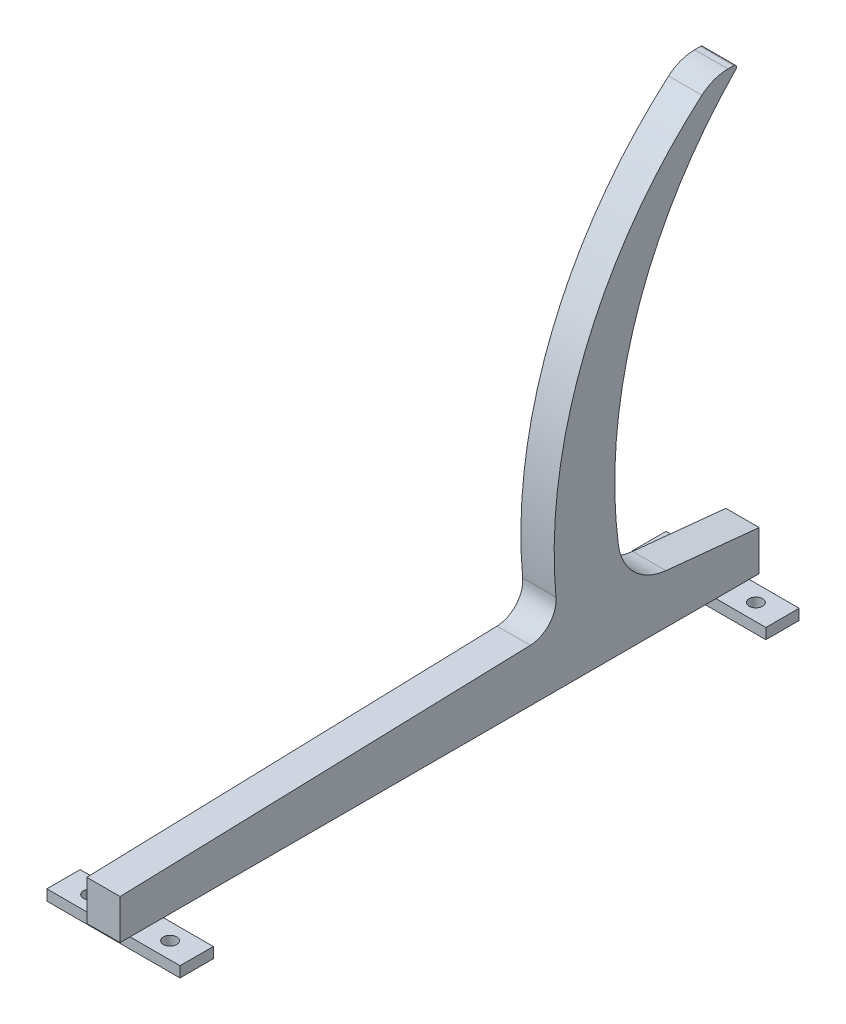
ISO-10303-21;
HEADER;
FILE_DESCRIPTION(('STEP AP214'),'2;1');
FILE_NAME('part.step','',(''),(''),'','','');
FILE_SCHEMA(('AUTOMOTIVE_DESIGN { 1 0 10303 214 1 1 1 1 }'));
ENDSEC;
DATA;
#1=APPLICATION_CONTEXT('core data for automotive mechanical design processes');
#2=APPLICATION_PROTOCOL_DEFINITION('international standard','automotive_design',2000,#1);
#3=PRODUCT_CONTEXT('',#1,'mechanical');
#4=PRODUCT('Part','Part','',(#3));
#5=PRODUCT_RELATED_PRODUCT_CATEGORY('part','',(#4));
#6=PRODUCT_DEFINITION_FORMATION('','',#4);
#7=PRODUCT_DEFINITION_CONTEXT('part definition',#1,'design');
#8=PRODUCT_DEFINITION('design','',#6,#7);
#9=PRODUCT_DEFINITION_SHAPE('','',#8);
#10=(LENGTH_UNIT() NAMED_UNIT(*) SI_UNIT(.MILLI.,.METRE.));
#11=(NAMED_UNIT(*) PLANE_ANGLE_UNIT() SI_UNIT($,.RADIAN.));
#12=(NAMED_UNIT(*) SI_UNIT($,.STERADIAN.) SOLID_ANGLE_UNIT());
#13=UNCERTAINTY_MEASURE_WITH_UNIT(LENGTH_MEASURE(1.E-05),#10,'distance_accuracy_value','');
#14=(GEOMETRIC_REPRESENTATION_CONTEXT(3) GLOBAL_UNCERTAINTY_ASSIGNED_CONTEXT((#13)) GLOBAL_UNIT_ASSIGNED_CONTEXT((#10,
#11,#12)) REPRESENTATION_CONTEXT('',''));
#15=CARTESIAN_POINT('',(0.,0.,0.));
#16=DIRECTION('',(0.,0.,1.));
#17=DIRECTION('',(1.,0.,0.));
#18=AXIS2_PLACEMENT_3D('',#15,#16,#17);
#19=CARTESIAN_POINT('',(15.875,0.,304.8));
#20=DIRECTION('',(0.,1.,0.));
#21=DIRECTION('',(0.,0.,1.));
#22=AXIS2_PLACEMENT_3D('',#19,#20,#21);
#23=PLANE('',#22);
#24=DIRECTION('',(1.,0.,0.));
#25=VECTOR('',#24,1.);
#26=CARTESIAN_POINT('',(-63.5,0.,263.525));
#27=LINE('',#26,#25);
#28=CARTESIAN_POINT('',(-15.875,0.,263.525));
#29=VERTEX_POINT('',#28);
#30=CARTESIAN_POINT('',(15.875,0.,263.525));
#31=VERTEX_POINT('',#30);
#32=EDGE_CURVE('E370',#29,#31,#27,.T.);
#33=ORIENTED_EDGE('',*,*,#32,.F.);
#34=DIRECTION('',(0.,0.,-1.));
#35=VECTOR('',#34,1.);
#36=CARTESIAN_POINT('',(-15.875,0.,304.8));
#37=LINE('',#36,#35);
#38=CARTESIAN_POINT('',(-15.875,1.04399608818813E-13,-263.525));
#39=VERTEX_POINT('',#38);
#40=EDGE_CURVE('E462',#29,#39,#37,.T.);
#41=ORIENTED_EDGE('',*,*,#40,.T.);
#42=DIRECTION('',(-1.,0.,0.));
#43=VECTOR('',#42,1.);
#44=CARTESIAN_POINT('',(-63.5,0.,-263.525));
#45=LINE('',#44,#43);
#46=CARTESIAN_POINT('',(15.875,1.04399608818813E-13,-263.525));
#47=VERTEX_POINT('',#46);
#48=EDGE_CURVE('E255',#47,#39,#45,.T.);
#49=ORIENTED_EDGE('',*,*,#48,.F.);
#50=DIRECTION('',(0.,0.,-1.));
#51=VECTOR('',#50,1.);
#52=CARTESIAN_POINT('',(15.875,0.,304.8));
#53=LINE('',#52,#51);
#54=EDGE_CURVE('E478',#31,#47,#53,.T.);
#55=ORIENTED_EDGE('',*,*,#54,.F.);
#56=EDGE_LOOP('',(#33,#41,#49,#55));
#57=FACE_BOUND('',#56,.T.);
#58=ADVANCED_FACE('F39',(#57),#23,.F.);
#59=DIRECTION('',(-1.,0.,0.));
#60=VECTOR('',#59,1.);
#61=CARTESIAN_POINT('',(-63.5,0.,295.275));
#62=LINE('',#61,#60);
#63=CARTESIAN_POINT('',(15.875,0.,295.275));
#64=VERTEX_POINT('',#63);
#65=CARTESIAN_POINT('',(-15.875,0.,295.275));
#66=VERTEX_POINT('',#65);
#67=EDGE_CURVE('E375',#64,#66,#62,.T.);
#68=ORIENTED_EDGE('',*,*,#67,.F.);
#69=CARTESIAN_POINT('',(15.875,0.,304.8));
#70=VERTEX_POINT('',#69);
#71=EDGE_CURVE('E290',#70,#64,#53,.T.);
#72=ORIENTED_EDGE('',*,*,#71,.F.);
#73=DIRECTION('',(-1.,0.,0.));
#74=VECTOR('',#73,1.);
#75=CARTESIAN_POINT('',(15.875,0.,304.8));
#76=LINE('',#75,#74);
#77=CARTESIAN_POINT('',(-15.875,0.,304.8));
#78=VERTEX_POINT('',#77);
#79=EDGE_CURVE('E341',#70,#78,#76,.T.);
#80=ORIENTED_EDGE('',*,*,#79,.T.);
#81=EDGE_CURVE('E309',#78,#66,#37,.T.);
#82=ORIENTED_EDGE('',*,*,#81,.T.);
#83=EDGE_LOOP('',(#68,#72,#80,#82));
#84=FACE_BOUND('',#83,.T.);
#85=ADVANCED_FACE('F424',(#84),#23,.F.);
#86=DIRECTION('',(1.,0.,0.));
#87=VECTOR('',#86,1.);
#88=CARTESIAN_POINT('',(-63.5,0.,-295.275));
#89=LINE('',#88,#87);
#90=CARTESIAN_POINT('',(-15.875,1.10231989199752E-13,-295.275));
#91=VERTEX_POINT('',#90);
#92=CARTESIAN_POINT('',(15.875,0.,-295.275));
#93=VERTEX_POINT('',#92);
#94=EDGE_CURVE('E261',#91,#93,#89,.T.);
#95=ORIENTED_EDGE('',*,*,#94,.F.);
#96=CARTESIAN_POINT('',(-15.875,1.11981703314034E-13,-304.8));
#97=VERTEX_POINT('',#96);
#98=EDGE_CURVE('E229',#91,#97,#37,.T.);
#99=ORIENTED_EDGE('',*,*,#98,.T.);
#100=DIRECTION('',(-1.,0.,0.));
#101=VECTOR('',#100,1.);
#102=CARTESIAN_POINT('',(15.875,1.11981703314034E-13,-304.8));
#103=LINE('',#102,#101);
#104=CARTESIAN_POINT('',(15.875,1.11981703314034E-13,-304.8));
#105=VERTEX_POINT('',#104);
#106=EDGE_CURVE('E337',#105,#97,#103,.T.);
#107=ORIENTED_EDGE('',*,*,#106,.F.);
#108=EDGE_CURVE('E289',#93,#105,#53,.T.);
#109=ORIENTED_EDGE('',*,*,#108,.F.);
#110=EDGE_LOOP('',(#95,#99,#107,#109));
#111=FACE_BOUND('',#110,.T.);
#112=ADVANCED_FACE('F430',(#111),#23,.F.);
#113=CARTESIAN_POINT('',(15.875,38.1,304.8));
#114=DIRECTION('',(0.,0.,-1.));
#115=DIRECTION('',(-1.,0.,0.));
#116=AXIS2_PLACEMENT_3D('',#113,#114,#115);
#117=PLANE('',#116);
#118=DIRECTION('',(0.,-1.,0.));
#119=VECTOR('',#118,1.);
#120=CARTESIAN_POINT('',(-15.875,38.1,304.8));
#121=LINE('',#120,#119);
#122=CARTESIAN_POINT('',(-15.875,38.1,304.8));
#123=VERTEX_POINT('',#122);
#124=EDGE_CURVE('E230',#123,#78,#121,.T.);
#125=ORIENTED_EDGE('',*,*,#124,.T.);
#126=ORIENTED_EDGE('',*,*,#79,.F.);
#127=DIRECTION('',(0.,-1.,0.));
#128=VECTOR('',#127,1.);
#129=CARTESIAN_POINT('',(15.875,38.1,304.8));
#130=LINE('',#129,#128);
#131=CARTESIAN_POINT('',(15.875,38.1,304.8));
#132=VERTEX_POINT('',#131);
#133=EDGE_CURVE('E284',#132,#70,#130,.T.);
#134=ORIENTED_EDGE('',*,*,#133,.F.);
#135=DIRECTION('',(-1.,0.,0.));
#136=VECTOR('',#135,1.);
#137=CARTESIAN_POINT('',(15.875,38.1,304.8));
#138=LINE('',#137,#136);
#139=EDGE_CURVE('E306',#132,#123,#138,.T.);
#140=ORIENTED_EDGE('',*,*,#139,.T.);
#141=EDGE_LOOP('',(#125,#126,#134,#140));
#142=FACE_BOUND('',#141,.T.);
#143=ADVANCED_FACE('F436',(#142),#117,.F.);
#144=CARTESIAN_POINT('',(15.875,38.1000000000001,-304.8));
#145=DIRECTION('',(0.,0.,1.));
#146=DIRECTION('',(1.,0.,0.));
#147=AXIS2_PLACEMENT_3D('',#144,#145,#146);
#148=PLANE('',#147);
#149=DIRECTION('',(0.,1.,0.));
#150=VECTOR('',#149,1.);
#151=CARTESIAN_POINT('',(-15.875,38.1000000000001,-304.8));
#152=LINE('',#151,#150);
#153=CARTESIAN_POINT('',(-15.875,38.1000000000001,-304.8));
#154=VERTEX_POINT('',#153);
#155=EDGE_CURVE('E315',#97,#154,#152,.T.);
#156=ORIENTED_EDGE('',*,*,#155,.T.);
#157=DIRECTION('',(-1.,0.,0.));
#158=VECTOR('',#157,1.);
#159=CARTESIAN_POINT('',(15.875,38.1000000000001,-304.8));
#160=LINE('',#159,#158);
#161=CARTESIAN_POINT('',(15.875,38.1000000000001,-304.8));
#162=VERTEX_POINT('',#161);
#163=EDGE_CURVE('E333',#162,#154,#160,.T.);
#164=ORIENTED_EDGE('',*,*,#163,.F.);
#165=DIRECTION('',(0.,1.,0.));
#166=VECTOR('',#165,1.);
#167=CARTESIAN_POINT('',(15.875,38.1000000000001,-304.8));
#168=LINE('',#167,#166);
#169=EDGE_CURVE('E291',#105,#162,#168,.T.);
#170=ORIENTED_EDGE('',*,*,#169,.F.);
#171=ORIENTED_EDGE('',*,*,#106,.T.);
#172=EDGE_LOOP('',(#156,#164,#170,#171));
#173=FACE_BOUND('',#172,.T.);
#174=ADVANCED_FACE('F445',(#173),#148,.F.);
#175=CARTESIAN_POINT('',(15.875,38.1000000000001,-304.8));
#176=DIRECTION('',(0.,-0.995037190209989,0.099503719020998));
#177=DIRECTION('',(0.,-0.099503719020998,-0.995037190209989));
#178=AXIS2_PLACEMENT_3D('',#175,#176,#177);
#179=PLANE('',#178);
#180=DIRECTION('',(0.,0.099503719020998,0.995037190209989));
#181=VECTOR('',#180,1.);
#182=CARTESIAN_POINT('',(-15.875,38.1000000000001,-304.8));
#183=LINE('',#182,#181);
#184=CARTESIAN_POINT('',(-15.875,47.0021545395077,-215.778454604923));
#185=VERTEX_POINT('',#184);
#186=EDGE_CURVE('E312',#154,#185,#183,.T.);
#187=ORIENTED_EDGE('',*,*,#186,.T.);
#188=DIRECTION('',(1.,0.,0.));
#189=VECTOR('',#188,1.);
#190=CARTESIAN_POINT('',(15.875,47.0021545395077,-215.778454604923));
#191=LINE('',#190,#189);
#192=CARTESIAN_POINT('',(15.875,47.0021545395077,-215.778454604923));
#193=VERTEX_POINT('',#192);
#194=EDGE_CURVE('E359',#185,#193,#191,.T.);
#195=ORIENTED_EDGE('',*,*,#194,.T.);
#196=DIRECTION('',(0.,0.099503719020998,0.995037190209989));
#197=VECTOR('',#196,1.);
#198=CARTESIAN_POINT('',(15.875,38.1000000000001,-304.8));
#199=LINE('',#198,#197);
#200=EDGE_CURVE('E296',#162,#193,#199,.T.);
#201=ORIENTED_EDGE('',*,*,#200,.F.);
#202=ORIENTED_EDGE('',*,*,#163,.T.);
#203=EDGE_LOOP('',(#187,#195,#201,#202));
#204=FACE_BOUND('',#203,.T.);
#205=ADVANCED_FACE('F491',(#204),#179,.F.);
#206=CARTESIAN_POINT('',(15.875,143.830650902039,-573.408718297187));
#207=DIRECTION('',(-1.,0.,0.));
#208=DIRECTION('',(0.,0.,1.));
#209=AXIS2_PLACEMENT_3D('',#206,#207,#208);
#210=CYLINDRICAL_SURFACE('',#209,406.4);
#211=CARTESIAN_POINT('',(-15.875,143.830650902039,-573.408718297187));
#212=DIRECTION('',(-1.,0.,0.));
#213=DIRECTION('',(0.,0.,1.));
#214=AXIS2_PLACEMENT_3D('',#211,#212,#213);
#215=CIRCLE('',#214,406.4);
#216=CARTESIAN_POINT('',(-15.875,90.9385285021946,-170.465318564619));
#217=VERTEX_POINT('',#216);
#218=CARTESIAN_POINT('',(-15.875,427.487146900013,-282.3761560672));
#219=VERTEX_POINT('',#218);
#220=EDGE_CURVE('E318',#217,#219,#215,.T.);
#221=ORIENTED_EDGE('',*,*,#220,.T.);
#222=DIRECTION('',(-1.,0.,0.));
#223=VECTOR('',#222,1.);
#224=CARTESIAN_POINT('',(15.875,427.487146900013,-282.3761560672));
#225=LINE('',#224,#223);
#226=CARTESIAN_POINT('',(15.875,427.487146900013,-282.3761560672));
#227=VERTEX_POINT('',#226);
#228=EDGE_CURVE('E50',#219,#227,#225,.F.);
#229=ORIENTED_EDGE('',*,*,#228,.T.);
#230=CARTESIAN_POINT('',(15.875,143.830650902039,-573.408718297187));
#231=DIRECTION('',(-1.,0.,0.));
#232=DIRECTION('',(0.,0.,1.));
#233=AXIS2_PLACEMENT_3D('',#230,#231,#232);
#234=CIRCLE('',#233,406.4);
#235=CARTESIAN_POINT('',(15.875,90.9385285021946,-170.465318564619));
#236=VERTEX_POINT('',#235);
#237=EDGE_CURVE('E298',#236,#227,#234,.T.);
#238=ORIENTED_EDGE('',*,*,#237,.F.);
#239=DIRECTION('',(-1.,0.,0.));
#240=VECTOR('',#239,1.);
#241=CARTESIAN_POINT('',(15.875,90.9385285021946,-170.465318564619));
#242=LINE('',#241,#240);
#243=EDGE_CURVE('E354',#236,#217,#242,.T.);
#244=ORIENTED_EDGE('',*,*,#243,.T.);
#245=EDGE_LOOP('',(#221,#229,#238,#244));
#246=FACE_BOUND('',#245,.T.);
#247=ADVANCED_FACE('F500',(#246),#210,.F.);
#248=CARTESIAN_POINT('',(15.875,431.8,-261.242935854273));
#249=DIRECTION('',(0.,-1.,0.));
#250=DIRECTION('',(0.,0.,-1.));
#251=AXIS2_PLACEMENT_3D('',#248,#249,#250);
#252=PLANE('',#251);
#253=DIRECTION('',(0.,0.,1.));
#254=VECTOR('',#253,1.);
#255=CARTESIAN_POINT('',(15.875,431.8,-261.242935854273));
#256=LINE('',#255,#254);
#257=CARTESIAN_POINT('',(15.875,431.8,-280.557202553262));
#258=VERTEX_POINT('',#257);
#259=CARTESIAN_POINT('',(15.875,431.8,-275.014272871448));
#260=VERTEX_POINT('',#259);
#261=EDGE_CURVE('E301',#258,#260,#256,.T.);
#262=ORIENTED_EDGE('',*,*,#261,.F.);
#263=DIRECTION('',(-1.,0.,0.));
#264=VECTOR('',#263,1.);
#265=CARTESIAN_POINT('',(15.875,431.8,-280.557202553262));
#266=LINE('',#265,#264);
#267=CARTESIAN_POINT('',(-15.875,431.8,-280.557202553262));
#268=VERTEX_POINT('',#267);
#269=EDGE_CURVE('E365',#258,#268,#266,.T.);
#270=ORIENTED_EDGE('',*,*,#269,.T.);
#271=DIRECTION('',(0.,0.,1.));
#272=VECTOR('',#271,1.);
#273=CARTESIAN_POINT('',(-15.875,431.8,-261.242935854273));
#274=LINE('',#273,#272);
#275=CARTESIAN_POINT('',(-15.875,431.8,-275.014272871448));
#276=VERTEX_POINT('',#275);
#277=EDGE_CURVE('E319',#268,#276,#274,.T.);
#278=ORIENTED_EDGE('',*,*,#277,.T.);
#279=DIRECTION('',(-1.,0.,0.));
#280=VECTOR('',#279,1.);
#281=CARTESIAN_POINT('',(15.875,431.8,-275.014272871448));
#282=LINE('',#281,#280);
#283=EDGE_CURVE('E348',#276,#260,#282,.F.);
#284=ORIENTED_EDGE('',*,*,#283,.T.);
#285=EDGE_LOOP('',(#262,#270,#278,#284));
#286=FACE_BOUND('',#285,.T.);
#287=ADVANCED_FACE('F549',(#286),#252,.F.);
#288=CARTESIAN_POINT('',(15.875,114.856362681626,-515.62));
#289=DIRECTION('',(-1.,0.,0.));
#290=DIRECTION('',(0.,0.,1.));
#291=AXIS2_PLACEMENT_3D('',#288,#289,#290);
#292=CYLINDRICAL_SURFACE('',#291,406.4);
#293=CARTESIAN_POINT('',(15.875,114.856362681626,-515.62));
#294=DIRECTION('',(1.,0.,0.));
#295=DIRECTION('',(0.,0.,1.));
#296=AXIS2_PLACEMENT_3D('',#293,#294,#295);
#297=CIRCLE('',#296,406.4);
#298=CARTESIAN_POINT('',(15.875,422.545893515694,-250.12402523746));
#299=VERTEX_POINT('',#298);
#300=CARTESIAN_POINT('',(15.875,77.6672433471819,-110.925140379658));
#301=VERTEX_POINT('',#300);
#302=EDGE_CURVE('E304',#299,#301,#297,.T.);
#303=ORIENTED_EDGE('',*,*,#302,.F.);
#304=DIRECTION('',(-1.,0.,0.));
#305=VECTOR('',#304,1.);
#306=CARTESIAN_POINT('',(15.875,422.545893515694,-250.12402523746));
#307=LINE('',#306,#305);
#308=CARTESIAN_POINT('',(-15.875,422.545893515694,-250.12402523746));
#309=VERTEX_POINT('',#308);
#310=EDGE_CURVE('E343',#299,#309,#307,.T.);
#311=ORIENTED_EDGE('',*,*,#310,.T.);
#312=CARTESIAN_POINT('',(-15.875,114.856362681626,-515.62));
#313=DIRECTION('',(1.,0.,0.));
#314=DIRECTION('',(0.,0.,1.));
#315=AXIS2_PLACEMENT_3D('',#312,#313,#314);
#316=CIRCLE('',#315,406.4);
#317=CARTESIAN_POINT('',(-15.875,77.6672433471819,-110.925140379658));
#318=VERTEX_POINT('',#317);
#319=EDGE_CURVE('E325',#309,#318,#316,.T.);
#320=ORIENTED_EDGE('',*,*,#319,.T.);
#321=DIRECTION('',(-1.,0.,0.));
#322=VECTOR('',#321,1.);
#323=CARTESIAN_POINT('',(15.875,77.6672433471819,-110.925140379658));
#324=LINE('',#323,#322);
#325=EDGE_CURVE('E335',#301,#318,#324,.T.);
#326=ORIENTED_EDGE('',*,*,#325,.F.);
#327=EDGE_LOOP('',(#303,#311,#320,#326));
#328=FACE_BOUND('',#327,.T.);
#329=ADVANCED_FACE('F542',(#328),#292,.T.);
#330=CARTESIAN_POINT('',(15.875,75.3429233887794,-85.6317116533864));
#331=DIRECTION('',(-1.,0.,0.));
#332=DIRECTION('',(0.,0.,1.));
#333=AXIS2_PLACEMENT_3D('',#330,#331,#332);
#334=CYLINDRICAL_SURFACE('',#333,25.4);
#335=CARTESIAN_POINT('',(-15.875,75.3429233887794,-85.6317116533864));
#336=DIRECTION('',(-1.,0.,0.));
#337=DIRECTION('',(0.,0.,-1.));
#338=AXIS2_PLACEMENT_3D('',#335,#336,#337);
#339=CIRCLE('',#338,25.4);
#340=CARTESIAN_POINT('',(-15.875,49.9545774384867,-86.4010554700619));
#341=VERTEX_POINT('',#340);
#342=EDGE_CURVE('E322',#318,#341,#339,.T.);
#343=ORIENTED_EDGE('',*,*,#342,.T.);
#344=DIRECTION('',(-1.,0.,0.));
#345=VECTOR('',#344,1.);
#346=CARTESIAN_POINT('',(15.875,49.9545774384867,-86.4010554700619));
#347=LINE('',#346,#345);
#348=CARTESIAN_POINT('',(15.875,49.9545774384867,-86.4010554700619));
#349=VERTEX_POINT('',#348);
#350=EDGE_CURVE('E328',#349,#341,#347,.T.);
#351=ORIENTED_EDGE('',*,*,#350,.F.);
#352=CARTESIAN_POINT('',(15.875,75.3429233887794,-85.6317116533864));
#353=DIRECTION('',(-1.,0.,0.));
#354=DIRECTION('',(0.,0.,-1.));
#355=AXIS2_PLACEMENT_3D('',#352,#353,#354);
#356=CIRCLE('',#355,25.4);
#357=EDGE_CURVE('E305',#301,#349,#356,.T.);
#358=ORIENTED_EDGE('',*,*,#357,.F.);
#359=ORIENTED_EDGE('',*,*,#325,.T.);
#360=EDGE_LOOP('',(#343,#351,#358,#359));
#361=FACE_BOUND('',#360,.T.);
#362=ADVANCED_FACE('F539',(#361),#334,.F.);
#363=CARTESIAN_POINT('',(15.875,38.1,304.8));
#364=DIRECTION('',(0.,-0.999541179145382,-0.0302891266407691));
#365=DIRECTION('',(0.,0.0302891266407691,-0.999541179145382));
#366=AXIS2_PLACEMENT_3D('',#363,#364,#365);
#367=PLANE('',#366);
#368=DIRECTION('',(0.,-0.0302891266407691,0.999541179145381));
#369=VECTOR('',#368,1.);
#370=CARTESIAN_POINT('',(-15.875,38.1,304.8));
#371=LINE('',#370,#369);
#372=EDGE_CURVE('E288',#341,#123,#371,.T.);
#373=ORIENTED_EDGE('',*,*,#372,.T.);
#374=ORIENTED_EDGE('',*,*,#139,.F.);
#375=DIRECTION('',(0.,-0.0302891266407691,0.999541179145381));
#376=VECTOR('',#375,1.);
#377=CARTESIAN_POINT('',(15.875,38.1,304.8));
#378=LINE('',#377,#376);
#379=EDGE_CURVE('E307',#349,#132,#378,.T.);
#380=ORIENTED_EDGE('',*,*,#379,.F.);
#381=ORIENTED_EDGE('',*,*,#350,.T.);
#382=EDGE_LOOP('',(#373,#374,#380,#381));
#383=FACE_BOUND('',#382,.T.);
#384=ADVANCED_FACE('F536',(#383),#367,.F.);
#385=CARTESIAN_POINT('',(15.875,143.830650902039,-573.408718297187));
#386=DIRECTION('',(-1.,0.,0.));
#387=DIRECTION('',(0.,0.,1.));
#388=AXIS2_PLACEMENT_3D('',#385,#386,#387);
#389=PLANE('',#388);
#390=ORIENTED_EDGE('',*,*,#237,.T.);
#391=CARTESIAN_POINT('',(15.875,429.26,-280.557202553262));
#392=DIRECTION('',(-1.,0.,0.));
#393=DIRECTION('',(0.,0.,1.));
#394=AXIS2_PLACEMENT_3D('',#391,#392,#393);
#395=CIRCLE('',#394,2.54);
#396=EDGE_CURVE('E11',#227,#258,#395,.F.);
#397=ORIENTED_EDGE('',*,*,#396,.T.);
#398=ORIENTED_EDGE('',*,*,#261,.T.);
#399=CARTESIAN_POINT('',(15.875,393.7,-275.014272871448));
#400=DIRECTION('',(-1.,0.,0.));
#401=DIRECTION('',(0.,0.,1.));
#402=AXIS2_PLACEMENT_3D('',#399,#400,#401);
#403=CIRCLE('',#402,38.1);
#404=EDGE_CURVE('E352',#260,#299,#403,.F.);
#405=ORIENTED_EDGE('',*,*,#404,.T.);
#406=ORIENTED_EDGE('',*,*,#302,.T.);
#407=ORIENTED_EDGE('',*,*,#357,.T.);
#408=ORIENTED_EDGE('',*,*,#379,.T.);
#409=ORIENTED_EDGE('',*,*,#133,.T.);
#410=ORIENTED_EDGE('',*,*,#71,.T.);
#411=EDGE_CURVE('E294',#64,#31,#53,.T.);
#412=ORIENTED_EDGE('',*,*,#411,.T.);
#413=ORIENTED_EDGE('',*,*,#54,.T.);
#414=EDGE_CURVE('E481',#47,#93,#53,.T.);
#415=ORIENTED_EDGE('',*,*,#414,.T.);
#416=ORIENTED_EDGE('',*,*,#108,.T.);
#417=ORIENTED_EDGE('',*,*,#169,.T.);
#418=ORIENTED_EDGE('',*,*,#200,.T.);
#419=CARTESIAN_POINT('',(15.875,97.5500438021751,-220.83324353119));
#420=DIRECTION('',(-1.,0.,0.));
#421=DIRECTION('',(0.,0.,1.));
#422=AXIS2_PLACEMENT_3D('',#419,#420,#421);
#423=CIRCLE('',#422,50.8);
#424=EDGE_CURVE('E362',#193,#236,#423,.T.);
#425=ORIENTED_EDGE('',*,*,#424,.T.);
#426=EDGE_LOOP('',(#390,#397,#398,#405,#406,#407,#408,#409,#410,#412,#413,#415,#416,#417,#418,#425));
#427=FACE_BOUND('',#426,.T.);
#428=ADVANCED_FACE('F477',(#427),#389,.F.);
#429=CARTESIAN_POINT('',(-15.875,143.830650902039,-573.408718297187));
#430=DIRECTION('',(-1.,0.,0.));
#431=DIRECTION('',(0.,0.,1.));
#432=AXIS2_PLACEMENT_3D('',#429,#430,#431);
#433=PLANE('',#432);
#434=ORIENTED_EDGE('',*,*,#277,.F.);
#435=CARTESIAN_POINT('',(-15.875,429.26,-280.557202553262));
#436=DIRECTION('',(-1.,0.,0.));
#437=DIRECTION('',(0.,0.,1.));
#438=AXIS2_PLACEMENT_3D('',#435,#436,#437);
#439=CIRCLE('',#438,2.54);
#440=EDGE_CURVE('E61',#268,#219,#439,.T.);
#441=ORIENTED_EDGE('',*,*,#440,.T.);
#442=ORIENTED_EDGE('',*,*,#220,.F.);
#443=CARTESIAN_POINT('',(-15.875,97.5500438021751,-220.83324353119));
#444=DIRECTION('',(-1.,0.,0.));
#445=DIRECTION('',(0.,0.,1.));
#446=AXIS2_PLACEMENT_3D('',#443,#444,#445);
#447=CIRCLE('',#446,50.8);
#448=EDGE_CURVE('E360',#217,#185,#447,.F.);
#449=ORIENTED_EDGE('',*,*,#448,.T.);
#450=ORIENTED_EDGE('',*,*,#186,.F.);
#451=ORIENTED_EDGE('',*,*,#155,.F.);
#452=ORIENTED_EDGE('',*,*,#98,.F.);
#453=EDGE_CURVE('E453',#39,#91,#37,.T.);
#454=ORIENTED_EDGE('',*,*,#453,.F.);
#455=ORIENTED_EDGE('',*,*,#40,.F.);
#456=EDGE_CURVE('E311',#66,#29,#37,.T.);
#457=ORIENTED_EDGE('',*,*,#456,.F.);
#458=ORIENTED_EDGE('',*,*,#81,.F.);
#459=ORIENTED_EDGE('',*,*,#124,.F.);
#460=ORIENTED_EDGE('',*,*,#372,.F.);
#461=ORIENTED_EDGE('',*,*,#342,.F.);
#462=ORIENTED_EDGE('',*,*,#319,.F.);
#463=CARTESIAN_POINT('',(-15.875,393.7,-275.014272871448));
#464=DIRECTION('',(-1.,0.,0.));
#465=DIRECTION('',(0.,0.,1.));
#466=AXIS2_PLACEMENT_3D('',#463,#464,#465);
#467=CIRCLE('',#466,38.1);
#468=EDGE_CURVE('E350',#309,#276,#467,.T.);
#469=ORIENTED_EDGE('',*,*,#468,.T.);
#470=EDGE_LOOP('',(#434,#441,#442,#449,#450,#451,#452,#454,#455,#457,#458,#459,#460,#461,#462,#469));
#471=FACE_BOUND('',#470,.T.);
#472=ADVANCED_FACE('F452',(#471),#433,.T.);
#473=CARTESIAN_POINT('',(15.875,393.7,-275.014272871448));
#474=DIRECTION('',(-1.,0.,0.));
#475=DIRECTION('',(0.,0.,1.));
#476=AXIS2_PLACEMENT_3D('',#473,#474,#475);
#477=CYLINDRICAL_SURFACE('',#476,38.1);
#478=ORIENTED_EDGE('',*,*,#404,.F.);
#479=ORIENTED_EDGE('',*,*,#283,.F.);
#480=ORIENTED_EDGE('',*,*,#468,.F.);
#481=ORIENTED_EDGE('',*,*,#310,.F.);
#482=EDGE_LOOP('',(#478,#479,#480,#481));
#483=FACE_BOUND('',#482,.T.);
#484=ADVANCED_FACE('F548',(#483),#477,.T.);
#485=CARTESIAN_POINT('',(15.875,97.5500438021751,-220.83324353119));
#486=DIRECTION('',(-1.,0.,0.));
#487=DIRECTION('',(0.,0.,1.));
#488=AXIS2_PLACEMENT_3D('',#485,#486,#487);
#489=CYLINDRICAL_SURFACE('',#488,50.8);
#490=ORIENTED_EDGE('',*,*,#424,.F.);
#491=ORIENTED_EDGE('',*,*,#194,.F.);
#492=ORIENTED_EDGE('',*,*,#448,.F.);
#493=ORIENTED_EDGE('',*,*,#243,.F.);
#494=EDGE_LOOP('',(#490,#491,#492,#493));
#495=FACE_BOUND('',#494,.T.);
#496=ADVANCED_FACE('F497',(#495),#489,.F.);
#497=CARTESIAN_POINT('',(0.,0.,0.));
#498=DIRECTION('',(0.,1.,0.));
#499=DIRECTION('',(0.,0.,1.));
#500=AXIS2_PLACEMENT_3D('',#497,#498,#499);
#501=PLANE('',#500);
#502=CARTESIAN_POINT('',(38.1,0.,-279.4));
#503=DIRECTION('',(0.,-1.,0.));
#504=DIRECTION('',(0.,0.,1.));
#505=AXIS2_PLACEMENT_3D('',#502,#503,#504);
#506=CIRCLE('',#505,6.35);
#507=CARTESIAN_POINT('',(38.1,0.,-273.05));
#508=VERTEX_POINT('',#507);
#509=EDGE_CURVE('E272',#508,#508,#506,.T.);
#510=ORIENTED_EDGE('',*,*,#509,.T.);
#511=EDGE_LOOP('',(#510));
#512=FACE_BOUND('',#511,.T.);
#513=ORIENTED_EDGE('',*,*,#414,.F.);
#514=CARTESIAN_POINT('',(63.5,0.,-263.525));
#515=VERTEX_POINT('',#514);
#516=EDGE_CURVE('E248',#515,#47,#45,.T.);
#517=ORIENTED_EDGE('',*,*,#516,.F.);
#518=DIRECTION('',(0.,0.,1.));
#519=VECTOR('',#518,1.);
#520=CARTESIAN_POINT('',(63.5,0.,-295.275));
#521=LINE('',#520,#519);
#522=CARTESIAN_POINT('',(63.5,0.,-295.275));
#523=VERTEX_POINT('',#522);
#524=EDGE_CURVE('E252',#523,#515,#521,.T.);
#525=ORIENTED_EDGE('',*,*,#524,.F.);
#526=EDGE_CURVE('E258',#93,#523,#89,.T.);
#527=ORIENTED_EDGE('',*,*,#526,.F.);
#528=EDGE_LOOP('',(#513,#517,#525,#527));
#529=FACE_BOUND('',#528,.T.);
#530=ADVANCED_FACE('F482',(#512,#529),#501,.T.);
#531=CARTESIAN_POINT('',(0.,-10.16,0.));
#532=DIRECTION('',(0.,1.,0.));
#533=DIRECTION('',(0.,0.,1.));
#534=AXIS2_PLACEMENT_3D('',#531,#532,#533);
#535=PLANE('',#534);
#536=DIRECTION('',(0.,0.,-1.));
#537=VECTOR('',#536,1.);
#538=CARTESIAN_POINT('',(-63.5,-10.1599999999999,-295.275));
#539=LINE('',#538,#537);
#540=CARTESIAN_POINT('',(-63.5,-10.16,-263.525));
#541=VERTEX_POINT('',#540);
#542=CARTESIAN_POINT('',(-63.5,-10.1599999999999,-295.275));
#543=VERTEX_POINT('',#542);
#544=EDGE_CURVE('E269',#541,#543,#539,.T.);
#545=ORIENTED_EDGE('',*,*,#544,.T.);
#546=DIRECTION('',(1.,0.,0.));
#547=VECTOR('',#546,1.);
#548=CARTESIAN_POINT('',(-63.5,-10.1599999999999,-295.275));
#549=LINE('',#548,#547);
#550=CARTESIAN_POINT('',(63.5,-10.1599999999999,-295.275));
#551=VERTEX_POINT('',#550);
#552=EDGE_CURVE('E268',#543,#551,#549,.T.);
#553=ORIENTED_EDGE('',*,*,#552,.T.);
#554=DIRECTION('',(0.,0.,1.));
#555=VECTOR('',#554,1.);
#556=CARTESIAN_POINT('',(63.5,-10.1599999999999,-295.275));
#557=LINE('',#556,#555);
#558=CARTESIAN_POINT('',(63.5,-10.16,-263.525));
#559=VERTEX_POINT('',#558);
#560=EDGE_CURVE('E266',#551,#559,#557,.T.);
#561=ORIENTED_EDGE('',*,*,#560,.T.);
#562=DIRECTION('',(-1.,0.,0.));
#563=VECTOR('',#562,1.);
#564=CARTESIAN_POINT('',(-63.5,-10.16,-263.525));
#565=LINE('',#564,#563);
#566=EDGE_CURVE('E249',#559,#541,#565,.T.);
#567=ORIENTED_EDGE('',*,*,#566,.T.);
#568=EDGE_LOOP('',(#545,#553,#561,#567));
#569=FACE_BOUND('',#568,.T.);
#570=CARTESIAN_POINT('',(38.1,-10.1599999999999,-279.4));
#571=DIRECTION('',(0.,-1.,0.));
#572=DIRECTION('',(0.,0.,1.));
#573=AXIS2_PLACEMENT_3D('',#570,#571,#572);
#574=CIRCLE('',#573,6.35);
#575=CARTESIAN_POINT('',(38.1,-10.16,-273.05));
#576=VERTEX_POINT('',#575);
#577=EDGE_CURVE('E262',#576,#576,#574,.T.);
#578=ORIENTED_EDGE('',*,*,#577,.F.);
#579=EDGE_LOOP('',(#578));
#580=FACE_BOUND('',#579,.T.);
#581=CARTESIAN_POINT('',(-38.1,-10.1599999999999,-279.4));
#582=DIRECTION('',(0.,-1.,0.));
#583=DIRECTION('',(0.,0.,1.));
#584=AXIS2_PLACEMENT_3D('',#581,#582,#583);
#585=CIRCLE('',#584,6.35);
#586=CARTESIAN_POINT('',(-38.1,-10.16,-273.05));
#587=VERTEX_POINT('',#586);
#588=EDGE_CURVE('E277',#587,#587,#585,.T.);
#589=ORIENTED_EDGE('',*,*,#588,.F.);
#590=EDGE_LOOP('',(#589));
#591=FACE_BOUND('',#590,.T.);
#592=ADVANCED_FACE('F627',(#569,#580,#591),#535,.F.);
#593=CARTESIAN_POINT('',(-63.5,0.,-263.525));
#594=VERTEX_POINT('',#593);
#595=EDGE_CURVE('E251',#39,#594,#45,.T.);
#596=ORIENTED_EDGE('',*,*,#595,.F.);
#597=ORIENTED_EDGE('',*,*,#453,.T.);
#598=CARTESIAN_POINT('',(-63.5,0.,-295.275));
#599=VERTEX_POINT('',#598);
#600=EDGE_CURVE('E260',#599,#91,#89,.T.);
#601=ORIENTED_EDGE('',*,*,#600,.F.);
#602=DIRECTION('',(0.,0.,-1.));
#603=VECTOR('',#602,1.);
#604=CARTESIAN_POINT('',(-63.5,0.,-295.275));
#605=LINE('',#604,#603);
#606=EDGE_CURVE('E257',#594,#599,#605,.T.);
#607=ORIENTED_EDGE('',*,*,#606,.F.);
#608=EDGE_LOOP('',(#596,#597,#601,#607));
#609=FACE_BOUND('',#608,.T.);
#610=CARTESIAN_POINT('',(-38.1,0.,-279.4));
#611=DIRECTION('',(0.,-1.,0.));
#612=DIRECTION('',(0.,0.,1.));
#613=AXIS2_PLACEMENT_3D('',#610,#611,#612);
#614=CIRCLE('',#613,6.35);
#615=CARTESIAN_POINT('',(-38.1,0.,-273.05));
#616=VERTEX_POINT('',#615);
#617=EDGE_CURVE('E276',#616,#616,#614,.T.);
#618=ORIENTED_EDGE('',*,*,#617,.T.);
#619=EDGE_LOOP('',(#618));
#620=FACE_BOUND('',#619,.T.);
#621=ADVANCED_FACE('F459',(#609,#620),#501,.T.);
#622=CARTESIAN_POINT('',(-63.5,-10.1599999999999,-295.275));
#623=DIRECTION('',(1.,0.,0.));
#624=DIRECTION('',(0.,0.,-1.));
#625=AXIS2_PLACEMENT_3D('',#622,#623,#624);
#626=PLANE('',#625);
#627=ORIENTED_EDGE('',*,*,#606,.T.);
#628=DIRECTION('',(0.,1.,0.));
#629=VECTOR('',#628,1.);
#630=CARTESIAN_POINT('',(-63.5,-10.1599999999999,-295.275));
#631=LINE('',#630,#629);
#632=EDGE_CURVE('E237',#543,#599,#631,.T.);
#633=ORIENTED_EDGE('',*,*,#632,.F.);
#634=ORIENTED_EDGE('',*,*,#544,.F.);
#635=DIRECTION('',(0.,1.,0.));
#636=VECTOR('',#635,1.);
#637=CARTESIAN_POINT('',(-63.5,-10.16,-263.525));
#638=LINE('',#637,#636);
#639=EDGE_CURVE('E244',#541,#594,#638,.T.);
#640=ORIENTED_EDGE('',*,*,#639,.T.);
#641=EDGE_LOOP('',(#627,#633,#634,#640));
#642=FACE_BOUND('',#641,.T.);
#643=ADVANCED_FACE('F468',(#642),#626,.F.);
#644=CARTESIAN_POINT('',(-63.5,-10.1599999999999,-295.275));
#645=DIRECTION('',(0.,0.,1.));
#646=DIRECTION('',(0.,-1.,0.));
#647=AXIS2_PLACEMENT_3D('',#644,#645,#646);
#648=PLANE('',#647);
#649=ORIENTED_EDGE('',*,*,#600,.T.);
#650=ORIENTED_EDGE('',*,*,#94,.T.);
#651=ORIENTED_EDGE('',*,*,#526,.T.);
#652=DIRECTION('',(0.,1.,0.));
#653=VECTOR('',#652,1.);
#654=CARTESIAN_POINT('',(63.5,-10.1599999999999,-295.275));
#655=LINE('',#654,#653);
#656=EDGE_CURVE('E239',#551,#523,#655,.T.);
#657=ORIENTED_EDGE('',*,*,#656,.F.);
#658=ORIENTED_EDGE('',*,*,#552,.F.);
#659=ORIENTED_EDGE('',*,*,#632,.T.);
#660=EDGE_LOOP('',(#649,#650,#651,#657,#658,#659));
#661=FACE_BOUND('',#660,.T.);
#662=ADVANCED_FACE('F463',(#661),#648,.F.);
#663=CARTESIAN_POINT('',(63.5,-10.1599999999999,-295.275));
#664=DIRECTION('',(-1.,0.,0.));
#665=DIRECTION('',(0.,0.,1.));
#666=AXIS2_PLACEMENT_3D('',#663,#664,#665);
#667=PLANE('',#666);
#668=ORIENTED_EDGE('',*,*,#524,.T.);
#669=DIRECTION('',(0.,1.,0.));
#670=VECTOR('',#669,1.);
#671=CARTESIAN_POINT('',(63.5,-10.16,-263.525));
#672=LINE('',#671,#670);
#673=EDGE_CURVE('E245',#559,#515,#672,.T.);
#674=ORIENTED_EDGE('',*,*,#673,.F.);
#675=ORIENTED_EDGE('',*,*,#560,.F.);
#676=ORIENTED_EDGE('',*,*,#656,.T.);
#677=EDGE_LOOP('',(#668,#674,#675,#676));
#678=FACE_BOUND('',#677,.T.);
#679=ADVANCED_FACE('F665',(#678),#667,.F.);
#680=CARTESIAN_POINT('',(-63.5,-10.16,-263.525));
#681=DIRECTION('',(0.,0.,-1.));
#682=DIRECTION('',(0.,1.,0.));
#683=AXIS2_PLACEMENT_3D('',#680,#681,#682);
#684=PLANE('',#683);
#685=ORIENTED_EDGE('',*,*,#516,.T.);
#686=ORIENTED_EDGE('',*,*,#48,.T.);
#687=ORIENTED_EDGE('',*,*,#595,.T.);
#688=ORIENTED_EDGE('',*,*,#639,.F.);
#689=ORIENTED_EDGE('',*,*,#566,.F.);
#690=ORIENTED_EDGE('',*,*,#673,.T.);
#691=EDGE_LOOP('',(#685,#686,#687,#688,#689,#690));
#692=FACE_BOUND('',#691,.T.);
#693=ADVANCED_FACE('F471',(#692),#684,.F.);
#694=CARTESIAN_POINT('',(38.1,-10.1599999999999,-279.4));
#695=DIRECTION('',(0.,1.,0.));
#696=DIRECTION('',(0.,0.,1.));
#697=AXIS2_PLACEMENT_3D('',#694,#695,#696);
#698=CYLINDRICAL_SURFACE('',#697,6.35);
#699=ORIENTED_EDGE('',*,*,#577,.T.);
#700=EDGE_LOOP('',(#699));
#701=FACE_BOUND('',#700,.T.);
#702=ORIENTED_EDGE('',*,*,#509,.F.);
#703=EDGE_LOOP('',(#702));
#704=FACE_BOUND('',#703,.T.);
#705=ADVANCED_FACE('F678',(#701,#704),#698,.F.);
#706=CARTESIAN_POINT('',(-38.1,-10.1599999999999,-279.4));
#707=DIRECTION('',(0.,1.,0.));
#708=DIRECTION('',(0.,0.,1.));
#709=AXIS2_PLACEMENT_3D('',#706,#707,#708);
#710=CYLINDRICAL_SURFACE('',#709,6.35);
#711=ORIENTED_EDGE('',*,*,#588,.T.);
#712=EDGE_LOOP('',(#711));
#713=FACE_BOUND('',#712,.T.);
#714=ORIENTED_EDGE('',*,*,#617,.F.);
#715=EDGE_LOOP('',(#714));
#716=FACE_BOUND('',#715,.T.);
#717=ADVANCED_FACE('F420',(#713,#716),#710,.F.);
#718=CARTESIAN_POINT('',(0.,0.,0.));
#719=DIRECTION('',(0.,-1.,0.));
#720=DIRECTION('',(0.,0.,-1.));
#721=AXIS2_PLACEMENT_3D('',#718,#719,#720);
#722=PLANE('',#721);
#723=CARTESIAN_POINT('',(-38.1,0.,279.4));
#724=DIRECTION('',(0.,-1.,0.));
#725=DIRECTION('',(0.,0.,-1.));
#726=AXIS2_PLACEMENT_3D('',#723,#724,#725);
#727=CIRCLE('',#726,6.35);
#728=CARTESIAN_POINT('',(-38.1,0.,273.05));
#729=VERTEX_POINT('',#728);
#730=EDGE_CURVE('E394',#729,#729,#727,.T.);
#731=ORIENTED_EDGE('',*,*,#730,.T.);
#732=EDGE_LOOP('',(#731));
#733=FACE_BOUND('',#732,.T.);
#734=CARTESIAN_POINT('',(-63.5,0.,295.275));
#735=VERTEX_POINT('',#734);
#736=EDGE_CURVE('E379',#66,#735,#62,.T.);
#737=ORIENTED_EDGE('',*,*,#736,.F.);
#738=ORIENTED_EDGE('',*,*,#456,.T.);
#739=CARTESIAN_POINT('',(-63.5,0.,263.525));
#740=VERTEX_POINT('',#739);
#741=EDGE_CURVE('E225',#740,#29,#27,.T.);
#742=ORIENTED_EDGE('',*,*,#741,.F.);
#743=DIRECTION('',(0.,0.,-1.));
#744=VECTOR('',#743,1.);
#745=CARTESIAN_POINT('',(-63.5,0.,295.275));
#746=LINE('',#745,#744);
#747=EDGE_CURVE('E382',#735,#740,#746,.T.);
#748=ORIENTED_EDGE('',*,*,#747,.F.);
#749=EDGE_LOOP('',(#737,#738,#742,#748));
#750=FACE_BOUND('',#749,.T.);
#751=ADVANCED_FACE('F409',(#733,#750),#722,.F.);
#752=CARTESIAN_POINT('',(0.,-10.16,0.));
#753=DIRECTION('',(0.,-1.,0.));
#754=DIRECTION('',(0.,0.,-1.));
#755=AXIS2_PLACEMENT_3D('',#752,#753,#754);
#756=PLANE('',#755);
#757=CARTESIAN_POINT('',(-38.1,-10.1600000000001,279.4));
#758=DIRECTION('',(0.,-1.,0.));
#759=DIRECTION('',(0.,0.,-1.));
#760=AXIS2_PLACEMENT_3D('',#757,#758,#759);
#761=CIRCLE('',#760,6.35);
#762=CARTESIAN_POINT('',(-38.1,-10.1600000000001,273.05));
#763=VERTEX_POINT('',#762);
#764=EDGE_CURVE('E391',#763,#763,#761,.T.);
#765=ORIENTED_EDGE('',*,*,#764,.F.);
#766=EDGE_LOOP('',(#765));
#767=FACE_BOUND('',#766,.T.);
#768=DIRECTION('',(0.,0.,1.));
#769=VECTOR('',#768,1.);
#770=CARTESIAN_POINT('',(63.5,-10.1600000000001,295.275));
#771=LINE('',#770,#769);
#772=CARTESIAN_POINT('',(63.5,-10.16,263.525));
#773=VERTEX_POINT('',#772);
#774=CARTESIAN_POINT('',(63.5,-10.1600000000001,295.275));
#775=VERTEX_POINT('',#774);
#776=EDGE_CURVE('E215',#773,#775,#771,.T.);
#777=ORIENTED_EDGE('',*,*,#776,.T.);
#778=DIRECTION('',(-1.,0.,0.));
#779=VECTOR('',#778,1.);
#780=CARTESIAN_POINT('',(-63.5,-10.1600000000001,295.275));
#781=LINE('',#780,#779);
#782=CARTESIAN_POINT('',(-63.5,-10.1600000000001,295.275));
#783=VERTEX_POINT('',#782);
#784=EDGE_CURVE('E199',#775,#783,#781,.T.);
#785=ORIENTED_EDGE('',*,*,#784,.T.);
#786=DIRECTION('',(0.,0.,-1.));
#787=VECTOR('',#786,1.);
#788=CARTESIAN_POINT('',(-63.5,-10.1600000000001,295.275));
#789=LINE('',#788,#787);
#790=CARTESIAN_POINT('',(-63.5,-10.16,263.525));
#791=VERTEX_POINT('',#790);
#792=EDGE_CURVE('E211',#783,#791,#789,.T.);
#793=ORIENTED_EDGE('',*,*,#792,.T.);
#794=DIRECTION('',(1.,0.,0.));
#795=VECTOR('',#794,1.);
#796=CARTESIAN_POINT('',(-63.5,-10.16,263.525));
#797=LINE('',#796,#795);
#798=EDGE_CURVE('E217',#791,#773,#797,.T.);
#799=ORIENTED_EDGE('',*,*,#798,.T.);
#800=EDGE_LOOP('',(#777,#785,#793,#799));
#801=FACE_BOUND('',#800,.T.);
#802=CARTESIAN_POINT('',(38.1,-10.1600000000001,279.4));
#803=DIRECTION('',(0.,-1.,0.));
#804=DIRECTION('',(0.,0.,-1.));
#805=AXIS2_PLACEMENT_3D('',#802,#803,#804);
#806=CIRCLE('',#805,6.35);
#807=CARTESIAN_POINT('',(38.1,-10.1600000000001,273.05));
#808=VERTEX_POINT('',#807);
#809=EDGE_CURVE('E399',#808,#808,#806,.T.);
#810=ORIENTED_EDGE('',*,*,#809,.F.);
#811=EDGE_LOOP('',(#810));
#812=FACE_BOUND('',#811,.T.);
#813=ADVANCED_FACE('F214',(#767,#801,#812),#756,.T.);
#814=ORIENTED_EDGE('',*,*,#411,.F.);
#815=CARTESIAN_POINT('',(63.5,0.,295.275));
#816=VERTEX_POINT('',#815);
#817=EDGE_CURVE('E377',#816,#64,#62,.T.);
#818=ORIENTED_EDGE('',*,*,#817,.F.);
#819=DIRECTION('',(0.,0.,1.));
#820=VECTOR('',#819,1.);
#821=CARTESIAN_POINT('',(63.5,0.,295.275));
#822=LINE('',#821,#820);
#823=CARTESIAN_POINT('',(63.5,0.,263.525));
#824=VERTEX_POINT('',#823);
#825=EDGE_CURVE('E226',#824,#816,#822,.T.);
#826=ORIENTED_EDGE('',*,*,#825,.F.);
#827=EDGE_CURVE('E372',#31,#824,#27,.T.);
#828=ORIENTED_EDGE('',*,*,#827,.F.);
#829=EDGE_LOOP('',(#814,#818,#826,#828));
#830=FACE_BOUND('',#829,.T.);
#831=CARTESIAN_POINT('',(38.1,0.,279.4));
#832=DIRECTION('',(0.,-1.,0.));
#833=DIRECTION('',(0.,0.,-1.));
#834=AXIS2_PLACEMENT_3D('',#831,#832,#833);
#835=CIRCLE('',#834,6.35);
#836=CARTESIAN_POINT('',(38.1,0.,273.05));
#837=VERTEX_POINT('',#836);
#838=EDGE_CURVE('E285',#837,#837,#835,.T.);
#839=ORIENTED_EDGE('',*,*,#838,.T.);
#840=EDGE_LOOP('',(#839));
#841=FACE_BOUND('',#840,.T.);
#842=ADVANCED_FACE('F408',(#830,#841),#722,.F.);
#843=CARTESIAN_POINT('',(63.5,-10.1600000000001,295.275));
#844=DIRECTION('',(-1.,0.,0.));
#845=DIRECTION('',(0.,0.,1.));
#846=AXIS2_PLACEMENT_3D('',#843,#844,#845);
#847=PLANE('',#846);
#848=ORIENTED_EDGE('',*,*,#825,.T.);
#849=DIRECTION('',(0.,1.,0.));
#850=VECTOR('',#849,1.);
#851=CARTESIAN_POINT('',(63.5,-10.1600000000001,295.275));
#852=LINE('',#851,#850);
#853=EDGE_CURVE('E202',#775,#816,#852,.T.);
#854=ORIENTED_EDGE('',*,*,#853,.F.);
#855=ORIENTED_EDGE('',*,*,#776,.F.);
#856=DIRECTION('',(0.,1.,0.));
#857=VECTOR('',#856,1.);
#858=CARTESIAN_POINT('',(63.5,-10.16,263.525));
#859=LINE('',#858,#857);
#860=EDGE_CURVE('E392',#773,#824,#859,.T.);
#861=ORIENTED_EDGE('',*,*,#860,.T.);
#862=EDGE_LOOP('',(#848,#854,#855,#861));
#863=FACE_BOUND('',#862,.T.);
#864=ADVANCED_FACE('F221',(#863),#847,.F.);
#865=CARTESIAN_POINT('',(-63.5,-10.1600000000001,295.275));
#866=DIRECTION('',(0.,0.,-1.));
#867=DIRECTION('',(0.,1.,0.));
#868=AXIS2_PLACEMENT_3D('',#865,#866,#867);
#869=PLANE('',#868);
#870=ORIENTED_EDGE('',*,*,#817,.T.);
#871=ORIENTED_EDGE('',*,*,#67,.T.);
#872=ORIENTED_EDGE('',*,*,#736,.T.);
#873=DIRECTION('',(0.,1.,0.));
#874=VECTOR('',#873,1.);
#875=CARTESIAN_POINT('',(-63.5,-10.1600000000001,295.275));
#876=LINE('',#875,#874);
#877=EDGE_CURVE('E208',#783,#735,#876,.T.);
#878=ORIENTED_EDGE('',*,*,#877,.F.);
#879=ORIENTED_EDGE('',*,*,#784,.F.);
#880=ORIENTED_EDGE('',*,*,#853,.T.);
#881=EDGE_LOOP('',(#870,#871,#872,#878,#879,#880));
#882=FACE_BOUND('',#881,.T.);
#883=ADVANCED_FACE('F201',(#882),#869,.F.);
#884=CARTESIAN_POINT('',(-63.5,-10.1600000000001,295.275));
#885=DIRECTION('',(1.,0.,0.));
#886=DIRECTION('',(0.,0.,-1.));
#887=AXIS2_PLACEMENT_3D('',#884,#885,#886);
#888=PLANE('',#887);
#889=ORIENTED_EDGE('',*,*,#747,.T.);
#890=DIRECTION('',(0.,1.,0.));
#891=VECTOR('',#890,1.);
#892=CARTESIAN_POINT('',(-63.5,-10.16,263.525));
#893=LINE('',#892,#891);
#894=EDGE_CURVE('E232',#791,#740,#893,.T.);
#895=ORIENTED_EDGE('',*,*,#894,.F.);
#896=ORIENTED_EDGE('',*,*,#792,.F.);
#897=ORIENTED_EDGE('',*,*,#877,.T.);
#898=EDGE_LOOP('',(#889,#895,#896,#897));
#899=FACE_BOUND('',#898,.T.);
#900=ADVANCED_FACE('F516',(#899),#888,.F.);
#901=CARTESIAN_POINT('',(-63.5,-10.16,263.525));
#902=DIRECTION('',(0.,0.,1.));
#903=DIRECTION('',(0.,-1.,0.));
#904=AXIS2_PLACEMENT_3D('',#901,#902,#903);
#905=PLANE('',#904);
#906=ORIENTED_EDGE('',*,*,#741,.T.);
#907=ORIENTED_EDGE('',*,*,#32,.T.);
#908=ORIENTED_EDGE('',*,*,#827,.T.);
#909=ORIENTED_EDGE('',*,*,#860,.F.);
#910=ORIENTED_EDGE('',*,*,#798,.F.);
#911=ORIENTED_EDGE('',*,*,#894,.T.);
#912=EDGE_LOOP('',(#906,#907,#908,#909,#910,#911));
#913=FACE_BOUND('',#912,.T.);
#914=ADVANCED_FACE('F512',(#913),#905,.F.);
#915=CARTESIAN_POINT('',(-38.1,-10.1600000000001,279.4));
#916=DIRECTION('',(0.,1.,0.));
#917=DIRECTION('',(0.,0.,1.));
#918=AXIS2_PLACEMENT_3D('',#915,#916,#917);
#919=CYLINDRICAL_SURFACE('',#918,6.35);
#920=ORIENTED_EDGE('',*,*,#764,.T.);
#921=EDGE_LOOP('',(#920));
#922=FACE_BOUND('',#921,.T.);
#923=ORIENTED_EDGE('',*,*,#730,.F.);
#924=EDGE_LOOP('',(#923));
#925=FACE_BOUND('',#924,.T.);
#926=ADVANCED_FACE('F504',(#922,#925),#919,.F.);
#927=CARTESIAN_POINT('',(38.1,-10.1600000000001,279.4));
#928=DIRECTION('',(0.,1.,0.));
#929=DIRECTION('',(0.,0.,1.));
#930=AXIS2_PLACEMENT_3D('',#927,#928,#929);
#931=CYLINDRICAL_SURFACE('',#930,6.35);
#932=ORIENTED_EDGE('',*,*,#809,.T.);
#933=EDGE_LOOP('',(#932));
#934=FACE_BOUND('',#933,.T.);
#935=ORIENTED_EDGE('',*,*,#838,.F.);
#936=EDGE_LOOP('',(#935));
#937=FACE_BOUND('',#936,.T.);
#938=ADVANCED_FACE('F406',(#934,#937),#931,.F.);
#939=CARTESIAN_POINT('',(15.875,429.26,-280.557202553262));
#940=DIRECTION('',(-1.,0.,0.));
#941=DIRECTION('',(0.,0.,1.));
#942=AXIS2_PLACEMENT_3D('',#939,#940,#941);
#943=CYLINDRICAL_SURFACE('',#942,2.54);
#944=ORIENTED_EDGE('',*,*,#396,.F.);
#945=ORIENTED_EDGE('',*,*,#228,.F.);
#946=ORIENTED_EDGE('',*,*,#440,.F.);
#947=ORIENTED_EDGE('',*,*,#269,.F.);
#948=EDGE_LOOP('',(#944,#945,#946,#947));
#949=FACE_BOUND('',#948,.T.);
#950=ADVANCED_FACE('F41',(#949),#943,.T.);
#951=CLOSED_SHELL('',(#58,#85,#112,#143,#174,#205,#247,#287,#329,#362,#384,#428,#472,#484,#496,
#530,#592,#621,#643,#662,#679,#693,#705,#717,#751,#813,#842,#864,#883,#900,#914,#926,#938,#950));
#952=MANIFOLD_SOLID_BREP('B2',#951);
#953=ADVANCED_BREP_SHAPE_REPRESENTATION('',(#18,#952),#14);
#954=SHAPE_DEFINITION_REPRESENTATION(#9,#953);
ENDSEC;
END-ISO-10303-21;
